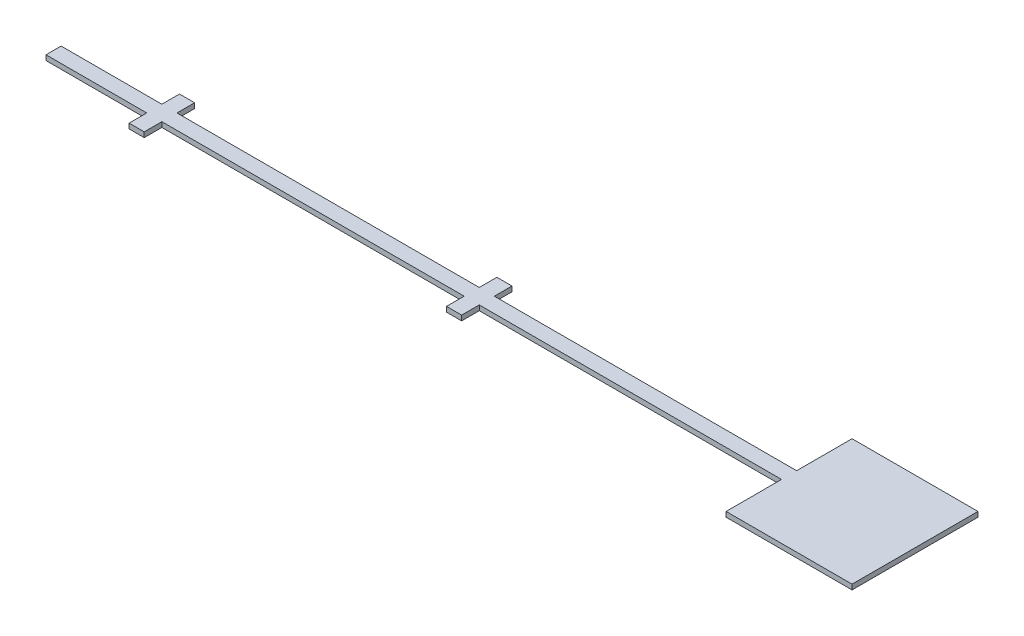
ISO-10303-21;
HEADER;
FILE_DESCRIPTION(('STEP AP214'),'2;1');
FILE_NAME('part.step','',(''),(''),'','','');
FILE_SCHEMA(('AUTOMOTIVE_DESIGN { 1 0 10303 214 1 1 1 1 }'));
ENDSEC;
DATA;
#1=APPLICATION_CONTEXT('core data for automotive mechanical design processes');
#2=APPLICATION_PROTOCOL_DEFINITION('international standard','automotive_design',2000,#1);
#3=PRODUCT_CONTEXT('',#1,'mechanical');
#4=PRODUCT('Part','Part','',(#3));
#5=PRODUCT_RELATED_PRODUCT_CATEGORY('part','',(#4));
#6=PRODUCT_DEFINITION_FORMATION('','',#4);
#7=PRODUCT_DEFINITION_CONTEXT('part definition',#1,'design');
#8=PRODUCT_DEFINITION('design','',#6,#7);
#9=PRODUCT_DEFINITION_SHAPE('','',#8);
#10=(LENGTH_UNIT() NAMED_UNIT(*) SI_UNIT(.MILLI.,.METRE.));
#11=(NAMED_UNIT(*) PLANE_ANGLE_UNIT() SI_UNIT($,.RADIAN.));
#12=(NAMED_UNIT(*) SI_UNIT($,.STERADIAN.) SOLID_ANGLE_UNIT());
#13=UNCERTAINTY_MEASURE_WITH_UNIT(LENGTH_MEASURE(1.E-05),#10,'distance_accuracy_value','');
#14=(GEOMETRIC_REPRESENTATION_CONTEXT(3) GLOBAL_UNCERTAINTY_ASSIGNED_CONTEXT((#13)) GLOBAL_UNIT_ASSIGNED_CONTEXT((#10,
#11,#12)) REPRESENTATION_CONTEXT('',''));
#15=CARTESIAN_POINT('',(0.,0.,0.));
#16=DIRECTION('',(0.,0.,1.));
#17=DIRECTION('',(1.,0.,0.));
#18=AXIS2_PLACEMENT_3D('',#15,#16,#17);
#19=CARTESIAN_POINT('',(-27.7142857142857,1.,-5.95238095238096));
#20=DIRECTION('',(0.,0.,1.));
#21=DIRECTION('',(1.,0.,0.));
#22=AXIS2_PLACEMENT_3D('',#19,#20,#21);
#23=PLANE('',#22);
#24=DIRECTION('',(-1.,0.,0.));
#25=VECTOR('',#24,1.);
#26=CARTESIAN_POINT('',(-27.7142857142857,0.,-5.95238095238096));
#27=LINE('',#26,#25);
#28=CARTESIAN_POINT('',(-27.7142857142857,0.,-5.95238095238096));
#29=VERTEX_POINT('',#28);
#30=CARTESIAN_POINT('',(-47.7142857142857,0.,-5.95238095238095));
#31=VERTEX_POINT('',#30);
#32=EDGE_CURVE('E225',#29,#31,#27,.T.);
#33=ORIENTED_EDGE('',*,*,#32,.T.);
#34=DIRECTION('',(0.,-1.,0.));
#35=VECTOR('',#34,1.);
#36=CARTESIAN_POINT('',(-47.7142857142857,1.,-5.95238095238095));
#37=LINE('',#36,#35);
#38=CARTESIAN_POINT('',(-47.7142857142857,1.,-5.95238095238095));
#39=VERTEX_POINT('',#38);
#40=EDGE_CURVE('E11',#39,#31,#37,.T.);
#41=ORIENTED_EDGE('',*,*,#40,.F.);
#42=DIRECTION('',(-1.,0.,0.));
#43=VECTOR('',#42,1.);
#44=CARTESIAN_POINT('',(-27.7142857142857,1.,-5.95238095238096));
#45=LINE('',#44,#43);
#46=CARTESIAN_POINT('',(-27.7142857142857,1.,-5.95238095238096));
#47=VERTEX_POINT('',#46);
#48=EDGE_CURVE('E271',#47,#39,#45,.T.);
#49=ORIENTED_EDGE('',*,*,#48,.F.);
#50=DIRECTION('',(0.,-1.,0.));
#51=VECTOR('',#50,1.);
#52=CARTESIAN_POINT('',(-27.7142857142857,1.,-5.95238095238096));
#53=LINE('',#52,#51);
#54=EDGE_CURVE('E221',#47,#29,#53,.T.);
#55=ORIENTED_EDGE('',*,*,#54,.T.);
#56=EDGE_LOOP('',(#33,#41,#49,#55));
#57=FACE_BOUND('',#56,.T.);
#58=ADVANCED_FACE('F33',(#57),#23,.F.);
#59=CARTESIAN_POINT('',(-47.7142857142857,1.,-5.95238095238095));
#60=DIRECTION('',(1.,0.,0.));
#61=DIRECTION('',(0.,0.,-1.));
#62=AXIS2_PLACEMENT_3D('',#59,#60,#61);
#63=PLANE('',#62);
#64=DIRECTION('',(0.,0.,1.));
#65=VECTOR('',#64,1.);
#66=CARTESIAN_POINT('',(-47.7142857142857,0.,-5.95238095238095));
#67=LINE('',#66,#65);
#68=CARTESIAN_POINT('',(-47.7142857142857,0.,-2.95238095238095));
#69=VERTEX_POINT('',#68);
#70=EDGE_CURVE('E228',#31,#69,#67,.T.);
#71=ORIENTED_EDGE('',*,*,#70,.T.);
#72=DIRECTION('',(0.,-1.,0.));
#73=VECTOR('',#72,1.);
#74=CARTESIAN_POINT('',(-47.7142857142857,1.,-2.95238095238095));
#75=LINE('',#74,#73);
#76=CARTESIAN_POINT('',(-47.7142857142857,1.,-2.95238095238095));
#77=VERTEX_POINT('',#76);
#78=EDGE_CURVE('E41',#77,#69,#75,.T.);
#79=ORIENTED_EDGE('',*,*,#78,.F.);
#80=DIRECTION('',(0.,0.,1.));
#81=VECTOR('',#80,1.);
#82=CARTESIAN_POINT('',(-47.7142857142857,1.,-5.95238095238095));
#83=LINE('',#82,#81);
#84=EDGE_CURVE('E140',#39,#77,#83,.T.);
#85=ORIENTED_EDGE('',*,*,#84,.F.);
#86=ORIENTED_EDGE('',*,*,#40,.T.);
#87=EDGE_LOOP('',(#71,#79,#85,#86));
#88=FACE_BOUND('',#87,.T.);
#89=ADVANCED_FACE('F409',(#88),#63,.F.);
#90=CARTESIAN_POINT('',(-47.7142857142857,1.,-2.95238095238095));
#91=DIRECTION('',(0.,0.,-1.));
#92=DIRECTION('',(-1.,0.,0.));
#93=AXIS2_PLACEMENT_3D('',#90,#91,#92);
#94=PLANE('',#93);
#95=DIRECTION('',(1.,0.,0.));
#96=VECTOR('',#95,1.);
#97=CARTESIAN_POINT('',(-47.7142857142857,0.,-2.95238095238095));
#98=LINE('',#97,#96);
#99=CARTESIAN_POINT('',(-27.7142857142857,0.,-2.95238095238095));
#100=VERTEX_POINT('',#99);
#101=EDGE_CURVE('E230',#69,#100,#98,.T.);
#102=ORIENTED_EDGE('',*,*,#101,.T.);
#103=DIRECTION('',(0.,-1.,0.));
#104=VECTOR('',#103,1.);
#105=CARTESIAN_POINT('',(-27.7142857142857,1.,-2.95238095238095));
#106=LINE('',#105,#104);
#107=CARTESIAN_POINT('',(-27.7142857142857,1.,-2.95238095238095));
#108=VERTEX_POINT('',#107);
#109=EDGE_CURVE('E326',#108,#100,#106,.T.);
#110=ORIENTED_EDGE('',*,*,#109,.F.);
#111=DIRECTION('',(1.,0.,0.));
#112=VECTOR('',#111,1.);
#113=CARTESIAN_POINT('',(-47.7142857142857,1.,-2.95238095238095));
#114=LINE('',#113,#112);
#115=EDGE_CURVE('E334',#77,#108,#114,.T.);
#116=ORIENTED_EDGE('',*,*,#115,.F.);
#117=ORIENTED_EDGE('',*,*,#78,.T.);
#118=EDGE_LOOP('',(#102,#110,#116,#117));
#119=FACE_BOUND('',#118,.T.);
#120=ADVANCED_FACE('F332',(#119),#94,.F.);
#121=CARTESIAN_POINT('',(-27.7142857142857,1.,-2.95238095238095));
#122=DIRECTION('',(1.,0.,0.));
#123=DIRECTION('',(0.,0.,-1.));
#124=AXIS2_PLACEMENT_3D('',#121,#122,#123);
#125=PLANE('',#124);
#126=DIRECTION('',(0.,0.,1.));
#127=VECTOR('',#126,1.);
#128=CARTESIAN_POINT('',(-27.7142857142857,0.,-2.95238095238095));
#129=LINE('',#128,#127);
#130=CARTESIAN_POINT('',(-27.7142857142857,0.,0.547619047619043));
#131=VERTEX_POINT('',#130);
#132=EDGE_CURVE('E232',#100,#131,#129,.T.);
#133=ORIENTED_EDGE('',*,*,#132,.T.);
#134=DIRECTION('',(0.,-1.,0.));
#135=VECTOR('',#134,1.);
#136=CARTESIAN_POINT('',(-27.7142857142857,1.,0.547619047619043));
#137=LINE('',#136,#135);
#138=CARTESIAN_POINT('',(-27.7142857142857,1.,0.547619047619043));
#139=VERTEX_POINT('',#138);
#140=EDGE_CURVE('E323',#139,#131,#137,.T.);
#141=ORIENTED_EDGE('',*,*,#140,.F.);
#142=DIRECTION('',(0.,0.,1.));
#143=VECTOR('',#142,1.);
#144=CARTESIAN_POINT('',(-27.7142857142857,1.,-2.95238095238095));
#145=LINE('',#144,#143);
#146=EDGE_CURVE('E352',#108,#139,#145,.T.);
#147=ORIENTED_EDGE('',*,*,#146,.F.);
#148=ORIENTED_EDGE('',*,*,#109,.T.);
#149=EDGE_LOOP('',(#133,#141,#147,#148));
#150=FACE_BOUND('',#149,.T.);
#151=ADVANCED_FACE('F343',(#150),#125,.F.);
#152=CARTESIAN_POINT('',(-27.7142857142857,1.,0.547619047619043));
#153=DIRECTION('',(0.,0.,-1.));
#154=DIRECTION('',(-1.,0.,0.));
#155=AXIS2_PLACEMENT_3D('',#152,#153,#154);
#156=PLANE('',#155);
#157=DIRECTION('',(1.,0.,0.));
#158=VECTOR('',#157,1.);
#159=CARTESIAN_POINT('',(-27.7142857142857,0.,0.547619047619043));
#160=LINE('',#159,#158);
#161=CARTESIAN_POINT('',(-24.7142857142857,0.,0.547619047619043));
#162=VERTEX_POINT('',#161);
#163=EDGE_CURVE('E234',#131,#162,#160,.T.);
#164=ORIENTED_EDGE('',*,*,#163,.T.);
#165=DIRECTION('',(0.,-1.,0.));
#166=VECTOR('',#165,1.);
#167=CARTESIAN_POINT('',(-24.7142857142857,1.,0.547619047619043));
#168=LINE('',#167,#166);
#169=CARTESIAN_POINT('',(-24.7142857142857,1.,0.547619047619043));
#170=VERTEX_POINT('',#169);
#171=EDGE_CURVE('E320',#170,#162,#168,.T.);
#172=ORIENTED_EDGE('',*,*,#171,.F.);
#173=DIRECTION('',(1.,0.,0.));
#174=VECTOR('',#173,1.);
#175=CARTESIAN_POINT('',(-27.7142857142857,1.,0.547619047619043));
#176=LINE('',#175,#174);
#177=EDGE_CURVE('E349',#139,#170,#176,.T.);
#178=ORIENTED_EDGE('',*,*,#177,.F.);
#179=ORIENTED_EDGE('',*,*,#140,.T.);
#180=EDGE_LOOP('',(#164,#172,#178,#179));
#181=FACE_BOUND('',#180,.T.);
#182=ADVANCED_FACE('F347',(#181),#156,.F.);
#183=CARTESIAN_POINT('',(-24.7142857142857,1.,0.547619047619043));
#184=DIRECTION('',(-1.,0.,0.));
#185=DIRECTION('',(0.,0.,1.));
#186=AXIS2_PLACEMENT_3D('',#183,#184,#185);
#187=PLANE('',#186);
#188=DIRECTION('',(0.,0.,-1.));
#189=VECTOR('',#188,1.);
#190=CARTESIAN_POINT('',(-24.7142857142857,0.,0.547619047619043));
#191=LINE('',#190,#189);
#192=CARTESIAN_POINT('',(-24.7142857142857,0.,-2.95238095238096));
#193=VERTEX_POINT('',#192);
#194=EDGE_CURVE('E236',#162,#193,#191,.T.);
#195=ORIENTED_EDGE('',*,*,#194,.T.);
#196=DIRECTION('',(0.,-1.,0.));
#197=VECTOR('',#196,1.);
#198=CARTESIAN_POINT('',(-24.7142857142857,1.,-2.95238095238096));
#199=LINE('',#198,#197);
#200=CARTESIAN_POINT('',(-24.7142857142857,1.,-2.95238095238096));
#201=VERTEX_POINT('',#200);
#202=EDGE_CURVE('E317',#201,#193,#199,.T.);
#203=ORIENTED_EDGE('',*,*,#202,.F.);
#204=DIRECTION('',(0.,0.,-1.));
#205=VECTOR('',#204,1.);
#206=CARTESIAN_POINT('',(-24.7142857142857,1.,0.547619047619043));
#207=LINE('',#206,#205);
#208=EDGE_CURVE('E351',#170,#201,#207,.T.);
#209=ORIENTED_EDGE('',*,*,#208,.F.);
#210=ORIENTED_EDGE('',*,*,#171,.T.);
#211=EDGE_LOOP('',(#195,#203,#209,#210));
#212=FACE_BOUND('',#211,.T.);
#213=ADVANCED_FACE('F422',(#212),#187,.F.);
#214=CARTESIAN_POINT('',(-24.7142857142857,1.,-2.95238095238096));
#215=DIRECTION('',(0.,0.,-1.));
#216=DIRECTION('',(-1.,0.,0.));
#217=AXIS2_PLACEMENT_3D('',#214,#215,#216);
#218=PLANE('',#217);
#219=DIRECTION('',(1.,0.,0.));
#220=VECTOR('',#219,1.);
#221=CARTESIAN_POINT('',(-24.7142857142857,0.,-2.95238095238096));
#222=LINE('',#221,#220);
#223=CARTESIAN_POINT('',(35.2857142857143,0.,-2.95238095238096));
#224=VERTEX_POINT('',#223);
#225=EDGE_CURVE('E238',#193,#224,#222,.T.);
#226=ORIENTED_EDGE('',*,*,#225,.T.);
#227=DIRECTION('',(0.,-1.,0.));
#228=VECTOR('',#227,1.);
#229=CARTESIAN_POINT('',(35.2857142857143,1.,-2.95238095238096));
#230=LINE('',#229,#228);
#231=CARTESIAN_POINT('',(35.2857142857143,1.,-2.95238095238096));
#232=VERTEX_POINT('',#231);
#233=EDGE_CURVE('E314',#232,#224,#230,.T.);
#234=ORIENTED_EDGE('',*,*,#233,.F.);
#235=DIRECTION('',(1.,0.,0.));
#236=VECTOR('',#235,1.);
#237=CARTESIAN_POINT('',(-24.7142857142857,1.,-2.95238095238096));
#238=LINE('',#237,#236);
#239=EDGE_CURVE('E354',#201,#232,#238,.T.);
#240=ORIENTED_EDGE('',*,*,#239,.F.);
#241=ORIENTED_EDGE('',*,*,#202,.T.);
#242=EDGE_LOOP('',(#226,#234,#240,#241));
#243=FACE_BOUND('',#242,.T.);
#244=ADVANCED_FACE('F425',(#243),#218,.F.);
#245=CARTESIAN_POINT('',(35.2857142857143,1.,-2.95238095238096));
#246=DIRECTION('',(1.,0.,0.));
#247=DIRECTION('',(0.,0.,-1.));
#248=AXIS2_PLACEMENT_3D('',#245,#246,#247);
#249=PLANE('',#248);
#250=DIRECTION('',(0.,0.,1.));
#251=VECTOR('',#250,1.);
#252=CARTESIAN_POINT('',(35.2857142857143,0.,-2.95238095238096));
#253=LINE('',#252,#251);
#254=CARTESIAN_POINT('',(35.2857142857143,0.,0.547619047619033));
#255=VERTEX_POINT('',#254);
#256=EDGE_CURVE('E240',#224,#255,#253,.T.);
#257=ORIENTED_EDGE('',*,*,#256,.T.);
#258=DIRECTION('',(0.,-1.,0.));
#259=VECTOR('',#258,1.);
#260=CARTESIAN_POINT('',(35.2857142857143,1.,0.547619047619033));
#261=LINE('',#260,#259);
#262=CARTESIAN_POINT('',(35.2857142857143,1.,0.547619047619033));
#263=VERTEX_POINT('',#262);
#264=EDGE_CURVE('E311',#263,#255,#261,.T.);
#265=ORIENTED_EDGE('',*,*,#264,.F.);
#266=DIRECTION('',(0.,0.,1.));
#267=VECTOR('',#266,1.);
#268=CARTESIAN_POINT('',(35.2857142857143,1.,-2.95238095238096));
#269=LINE('',#268,#267);
#270=EDGE_CURVE('E360',#232,#263,#269,.T.);
#271=ORIENTED_EDGE('',*,*,#270,.F.);
#272=ORIENTED_EDGE('',*,*,#233,.T.);
#273=EDGE_LOOP('',(#257,#265,#271,#272));
#274=FACE_BOUND('',#273,.T.);
#275=ADVANCED_FACE('F429',(#274),#249,.F.);
#276=CARTESIAN_POINT('',(35.2857142857143,1.,0.547619047619033));
#277=DIRECTION('',(0.,0.,-1.));
#278=DIRECTION('',(-1.,0.,0.));
#279=AXIS2_PLACEMENT_3D('',#276,#277,#278);
#280=PLANE('',#279);
#281=DIRECTION('',(1.,0.,0.));
#282=VECTOR('',#281,1.);
#283=CARTESIAN_POINT('',(35.2857142857143,0.,0.547619047619033));
#284=LINE('',#283,#282);
#285=CARTESIAN_POINT('',(38.2857142857143,0.,0.547619047619033));
#286=VERTEX_POINT('',#285);
#287=EDGE_CURVE('E242',#255,#286,#284,.T.);
#288=ORIENTED_EDGE('',*,*,#287,.T.);
#289=DIRECTION('',(0.,-1.,0.));
#290=VECTOR('',#289,1.);
#291=CARTESIAN_POINT('',(38.2857142857143,1.,0.547619047619033));
#292=LINE('',#291,#290);
#293=CARTESIAN_POINT('',(38.2857142857143,1.,0.547619047619033));
#294=VERTEX_POINT('',#293);
#295=EDGE_CURVE('E308',#294,#286,#292,.T.);
#296=ORIENTED_EDGE('',*,*,#295,.F.);
#297=DIRECTION('',(1.,0.,0.));
#298=VECTOR('',#297,1.);
#299=CARTESIAN_POINT('',(35.2857142857143,1.,0.547619047619033));
#300=LINE('',#299,#298);
#301=EDGE_CURVE('E362',#263,#294,#300,.T.);
#302=ORIENTED_EDGE('',*,*,#301,.F.);
#303=ORIENTED_EDGE('',*,*,#264,.T.);
#304=EDGE_LOOP('',(#288,#296,#302,#303));
#305=FACE_BOUND('',#304,.T.);
#306=ADVANCED_FACE('F433',(#305),#280,.F.);
#307=CARTESIAN_POINT('',(38.2857142857143,1.,0.547619047619033));
#308=DIRECTION('',(-1.,0.,0.));
#309=DIRECTION('',(0.,0.,1.));
#310=AXIS2_PLACEMENT_3D('',#307,#308,#309);
#311=PLANE('',#310);
#312=DIRECTION('',(0.,0.,-1.));
#313=VECTOR('',#312,1.);
#314=CARTESIAN_POINT('',(38.2857142857143,0.,0.547619047619033));
#315=LINE('',#314,#313);
#316=CARTESIAN_POINT('',(38.2857142857143,0.,-2.95238095238097));
#317=VERTEX_POINT('',#316);
#318=EDGE_CURVE('E244',#286,#317,#315,.T.);
#319=ORIENTED_EDGE('',*,*,#318,.T.);
#320=DIRECTION('',(0.,-1.,0.));
#321=VECTOR('',#320,1.);
#322=CARTESIAN_POINT('',(38.2857142857143,1.,-2.95238095238097));
#323=LINE('',#322,#321);
#324=CARTESIAN_POINT('',(38.2857142857143,1.,-2.95238095238097));
#325=VERTEX_POINT('',#324);
#326=EDGE_CURVE('E305',#325,#317,#323,.T.);
#327=ORIENTED_EDGE('',*,*,#326,.F.);
#328=DIRECTION('',(0.,0.,-1.));
#329=VECTOR('',#328,1.);
#330=CARTESIAN_POINT('',(38.2857142857143,1.,0.547619047619033));
#331=LINE('',#330,#329);
#332=EDGE_CURVE('E364',#294,#325,#331,.T.);
#333=ORIENTED_EDGE('',*,*,#332,.F.);
#334=ORIENTED_EDGE('',*,*,#295,.T.);
#335=EDGE_LOOP('',(#319,#327,#333,#334));
#336=FACE_BOUND('',#335,.T.);
#337=ADVANCED_FACE('F437',(#336),#311,.F.);
#338=CARTESIAN_POINT('',(38.2857142857143,1.,-2.95238095238097));
#339=DIRECTION('',(0.,0.,-1.));
#340=DIRECTION('',(-1.,0.,0.));
#341=AXIS2_PLACEMENT_3D('',#338,#339,#340);
#342=PLANE('',#341);
#343=DIRECTION('',(1.,0.,0.));
#344=VECTOR('',#343,1.);
#345=CARTESIAN_POINT('',(38.2857142857143,0.,-2.95238095238097));
#346=LINE('',#345,#344);
#347=CARTESIAN_POINT('',(98.2857142857143,0.,-2.95238095238097));
#348=VERTEX_POINT('',#347);
#349=EDGE_CURVE('E246',#317,#348,#346,.T.);
#350=ORIENTED_EDGE('',*,*,#349,.T.);
#351=DIRECTION('',(0.,-1.,0.));
#352=VECTOR('',#351,1.);
#353=CARTESIAN_POINT('',(98.2857142857143,1.,-2.95238095238097));
#354=LINE('',#353,#352);
#355=CARTESIAN_POINT('',(98.2857142857143,1.,-2.95238095238097));
#356=VERTEX_POINT('',#355);
#357=EDGE_CURVE('E302',#356,#348,#354,.T.);
#358=ORIENTED_EDGE('',*,*,#357,.F.);
#359=DIRECTION('',(1.,0.,0.));
#360=VECTOR('',#359,1.);
#361=CARTESIAN_POINT('',(38.2857142857143,1.,-2.95238095238097));
#362=LINE('',#361,#360);
#363=EDGE_CURVE('E366',#325,#356,#362,.T.);
#364=ORIENTED_EDGE('',*,*,#363,.F.);
#365=ORIENTED_EDGE('',*,*,#326,.T.);
#366=EDGE_LOOP('',(#350,#358,#364,#365));
#367=FACE_BOUND('',#366,.T.);
#368=ADVANCED_FACE('F441',(#367),#342,.F.);
#369=CARTESIAN_POINT('',(98.2857142857143,1.,-2.95238095238097));
#370=DIRECTION('',(1.,0.,0.));
#371=DIRECTION('',(0.,0.,-1.));
#372=AXIS2_PLACEMENT_3D('',#369,#370,#371);
#373=PLANE('',#372);
#374=DIRECTION('',(0.,0.,1.));
#375=VECTOR('',#374,1.);
#376=CARTESIAN_POINT('',(98.2857142857143,0.,-2.95238095238097));
#377=LINE('',#376,#375);
#378=CARTESIAN_POINT('',(98.2857142857143,0.,8.04761904761903));
#379=VERTEX_POINT('',#378);
#380=EDGE_CURVE('E248',#348,#379,#377,.T.);
#381=ORIENTED_EDGE('',*,*,#380,.T.);
#382=DIRECTION('',(0.,-1.,0.));
#383=VECTOR('',#382,1.);
#384=CARTESIAN_POINT('',(98.2857142857143,1.,8.04761904761903));
#385=LINE('',#384,#383);
#386=CARTESIAN_POINT('',(98.2857142857143,1.,8.04761904761903));
#387=VERTEX_POINT('',#386);
#388=EDGE_CURVE('E299',#387,#379,#385,.T.);
#389=ORIENTED_EDGE('',*,*,#388,.F.);
#390=DIRECTION('',(0.,0.,1.));
#391=VECTOR('',#390,1.);
#392=CARTESIAN_POINT('',(98.2857142857143,1.,-2.95238095238097));
#393=LINE('',#392,#391);
#394=EDGE_CURVE('E368',#356,#387,#393,.T.);
#395=ORIENTED_EDGE('',*,*,#394,.F.);
#396=ORIENTED_EDGE('',*,*,#357,.T.);
#397=EDGE_LOOP('',(#381,#389,#395,#396));
#398=FACE_BOUND('',#397,.T.);
#399=ADVANCED_FACE('F445',(#398),#373,.F.);
#400=CARTESIAN_POINT('',(98.2857142857143,1.,8.04761904761903));
#401=DIRECTION('',(0.,0.,-1.));
#402=DIRECTION('',(-1.,0.,0.));
#403=AXIS2_PLACEMENT_3D('',#400,#401,#402);
#404=PLANE('',#403);
#405=DIRECTION('',(1.,0.,0.));
#406=VECTOR('',#405,1.);
#407=CARTESIAN_POINT('',(98.2857142857143,0.,8.04761904761903));
#408=LINE('',#407,#406);
#409=CARTESIAN_POINT('',(123.285714285714,0.,8.04761904761904));
#410=VERTEX_POINT('',#409);
#411=EDGE_CURVE('E250',#379,#410,#408,.T.);
#412=ORIENTED_EDGE('',*,*,#411,.T.);
#413=DIRECTION('',(0.,-1.,0.));
#414=VECTOR('',#413,1.);
#415=CARTESIAN_POINT('',(123.285714285714,1.,8.04761904761904));
#416=LINE('',#415,#414);
#417=CARTESIAN_POINT('',(123.285714285714,1.,8.04761904761904));
#418=VERTEX_POINT('',#417);
#419=EDGE_CURVE('E296',#418,#410,#416,.T.);
#420=ORIENTED_EDGE('',*,*,#419,.F.);
#421=DIRECTION('',(1.,0.,0.));
#422=VECTOR('',#421,1.);
#423=CARTESIAN_POINT('',(98.2857142857143,1.,8.04761904761903));
#424=LINE('',#423,#422);
#425=EDGE_CURVE('E370',#387,#418,#424,.T.);
#426=ORIENTED_EDGE('',*,*,#425,.F.);
#427=ORIENTED_EDGE('',*,*,#388,.T.);
#428=EDGE_LOOP('',(#412,#420,#426,#427));
#429=FACE_BOUND('',#428,.T.);
#430=ADVANCED_FACE('F449',(#429),#404,.F.);
#431=CARTESIAN_POINT('',(123.285714285714,1.,8.04761904761904));
#432=DIRECTION('',(-1.,0.,0.));
#433=DIRECTION('',(0.,0.,1.));
#434=AXIS2_PLACEMENT_3D('',#431,#432,#433);
#435=PLANE('',#434);
#436=DIRECTION('',(0.,0.,-1.));
#437=VECTOR('',#436,1.);
#438=CARTESIAN_POINT('',(123.285714285714,0.,8.04761904761904));
#439=LINE('',#438,#437);
#440=CARTESIAN_POINT('',(123.285714285714,0.,-16.952380952381));
#441=VERTEX_POINT('',#440);
#442=EDGE_CURVE('E252',#410,#441,#439,.T.);
#443=ORIENTED_EDGE('',*,*,#442,.T.);
#444=DIRECTION('',(0.,-1.,0.));
#445=VECTOR('',#444,1.);
#446=CARTESIAN_POINT('',(123.285714285714,1.,-16.952380952381));
#447=LINE('',#446,#445);
#448=CARTESIAN_POINT('',(123.285714285714,1.,-16.952380952381));
#449=VERTEX_POINT('',#448);
#450=EDGE_CURVE('E293',#449,#441,#447,.T.);
#451=ORIENTED_EDGE('',*,*,#450,.F.);
#452=DIRECTION('',(0.,0.,-1.));
#453=VECTOR('',#452,1.);
#454=CARTESIAN_POINT('',(123.285714285714,1.,8.04761904761904));
#455=LINE('',#454,#453);
#456=EDGE_CURVE('E372',#418,#449,#455,.T.);
#457=ORIENTED_EDGE('',*,*,#456,.F.);
#458=ORIENTED_EDGE('',*,*,#419,.T.);
#459=EDGE_LOOP('',(#443,#451,#457,#458));
#460=FACE_BOUND('',#459,.T.);
#461=ADVANCED_FACE('F453',(#460),#435,.F.);
#462=CARTESIAN_POINT('',(123.285714285714,1.,-16.952380952381));
#463=DIRECTION('',(0.,0.,1.));
#464=DIRECTION('',(1.,0.,0.));
#465=AXIS2_PLACEMENT_3D('',#462,#463,#464);
#466=PLANE('',#465);
#467=DIRECTION('',(-1.,0.,0.));
#468=VECTOR('',#467,1.);
#469=CARTESIAN_POINT('',(123.285714285714,0.,-16.952380952381));
#470=LINE('',#469,#468);
#471=CARTESIAN_POINT('',(98.2857142857143,0.,-16.952380952381));
#472=VERTEX_POINT('',#471);
#473=EDGE_CURVE('E254',#441,#472,#470,.T.);
#474=ORIENTED_EDGE('',*,*,#473,.T.);
#475=DIRECTION('',(0.,-1.,0.));
#476=VECTOR('',#475,1.);
#477=CARTESIAN_POINT('',(98.2857142857143,1.,-16.952380952381));
#478=LINE('',#477,#476);
#479=CARTESIAN_POINT('',(98.2857142857143,1.,-16.952380952381));
#480=VERTEX_POINT('',#479);
#481=EDGE_CURVE('E290',#480,#472,#478,.T.);
#482=ORIENTED_EDGE('',*,*,#481,.F.);
#483=DIRECTION('',(-1.,0.,0.));
#484=VECTOR('',#483,1.);
#485=CARTESIAN_POINT('',(123.285714285714,1.,-16.952380952381));
#486=LINE('',#485,#484);
#487=EDGE_CURVE('E374',#449,#480,#486,.T.);
#488=ORIENTED_EDGE('',*,*,#487,.F.);
#489=ORIENTED_EDGE('',*,*,#450,.T.);
#490=EDGE_LOOP('',(#474,#482,#488,#489));
#491=FACE_BOUND('',#490,.T.);
#492=ADVANCED_FACE('F457',(#491),#466,.F.);
#493=CARTESIAN_POINT('',(98.2857142857143,1.,-16.952380952381));
#494=DIRECTION('',(1.,0.,0.));
#495=DIRECTION('',(0.,0.,-1.));
#496=AXIS2_PLACEMENT_3D('',#493,#494,#495);
#497=PLANE('',#496);
#498=DIRECTION('',(0.,0.,1.));
#499=VECTOR('',#498,1.);
#500=CARTESIAN_POINT('',(98.2857142857143,0.,-16.952380952381));
#501=LINE('',#500,#499);
#502=CARTESIAN_POINT('',(98.2857142857143,0.,-5.95238095238098));
#503=VERTEX_POINT('',#502);
#504=EDGE_CURVE('E256',#472,#503,#501,.T.);
#505=ORIENTED_EDGE('',*,*,#504,.T.);
#506=DIRECTION('',(0.,-1.,0.));
#507=VECTOR('',#506,1.);
#508=CARTESIAN_POINT('',(98.2857142857143,1.,-5.95238095238098));
#509=LINE('',#508,#507);
#510=CARTESIAN_POINT('',(98.2857142857143,1.,-5.95238095238098));
#511=VERTEX_POINT('',#510);
#512=EDGE_CURVE('E287',#511,#503,#509,.T.);
#513=ORIENTED_EDGE('',*,*,#512,.F.);
#514=DIRECTION('',(0.,0.,1.));
#515=VECTOR('',#514,1.);
#516=CARTESIAN_POINT('',(98.2857142857143,1.,-16.952380952381));
#517=LINE('',#516,#515);
#518=EDGE_CURVE('E376',#480,#511,#517,.T.);
#519=ORIENTED_EDGE('',*,*,#518,.F.);
#520=ORIENTED_EDGE('',*,*,#481,.T.);
#521=EDGE_LOOP('',(#505,#513,#519,#520));
#522=FACE_BOUND('',#521,.T.);
#523=ADVANCED_FACE('F461',(#522),#497,.F.);
#524=CARTESIAN_POINT('',(98.2857142857143,1.,-5.95238095238098));
#525=DIRECTION('',(0.,0.,1.));
#526=DIRECTION('',(1.,0.,0.));
#527=AXIS2_PLACEMENT_3D('',#524,#525,#526);
#528=PLANE('',#527);
#529=DIRECTION('',(-1.,0.,0.));
#530=VECTOR('',#529,1.);
#531=CARTESIAN_POINT('',(98.2857142857143,0.,-5.95238095238098));
#532=LINE('',#531,#530);
#533=CARTESIAN_POINT('',(38.2857142857142,0.,-5.95238095238097));
#534=VERTEX_POINT('',#533);
#535=EDGE_CURVE('E258',#503,#534,#532,.T.);
#536=ORIENTED_EDGE('',*,*,#535,.T.);
#537=DIRECTION('',(0.,-1.,0.));
#538=VECTOR('',#537,1.);
#539=CARTESIAN_POINT('',(38.2857142857142,1.,-5.95238095238097));
#540=LINE('',#539,#538);
#541=CARTESIAN_POINT('',(38.2857142857142,1.,-5.95238095238097));
#542=VERTEX_POINT('',#541);
#543=EDGE_CURVE('E284',#542,#534,#540,.T.);
#544=ORIENTED_EDGE('',*,*,#543,.F.);
#545=DIRECTION('',(-1.,0.,0.));
#546=VECTOR('',#545,1.);
#547=CARTESIAN_POINT('',(98.2857142857143,1.,-5.95238095238098));
#548=LINE('',#547,#546);
#549=EDGE_CURVE('E378',#511,#542,#548,.T.);
#550=ORIENTED_EDGE('',*,*,#549,.F.);
#551=ORIENTED_EDGE('',*,*,#512,.T.);
#552=EDGE_LOOP('',(#536,#544,#550,#551));
#553=FACE_BOUND('',#552,.T.);
#554=ADVANCED_FACE('F465',(#553),#528,.F.);
#555=CARTESIAN_POINT('',(38.2857142857142,1.,-5.95238095238097));
#556=DIRECTION('',(-1.,0.,0.));
#557=DIRECTION('',(0.,0.,1.));
#558=AXIS2_PLACEMENT_3D('',#555,#556,#557);
#559=PLANE('',#558);
#560=DIRECTION('',(0.,0.,-1.));
#561=VECTOR('',#560,1.);
#562=CARTESIAN_POINT('',(38.2857142857142,0.,-5.95238095238097));
#563=LINE('',#562,#561);
#564=CARTESIAN_POINT('',(38.2857142857142,0.,-9.45238095238096));
#565=VERTEX_POINT('',#564);
#566=EDGE_CURVE('E260',#534,#565,#563,.T.);
#567=ORIENTED_EDGE('',*,*,#566,.T.);
#568=DIRECTION('',(0.,-1.,0.));
#569=VECTOR('',#568,1.);
#570=CARTESIAN_POINT('',(38.2857142857142,1.,-9.45238095238096));
#571=LINE('',#570,#569);
#572=CARTESIAN_POINT('',(38.2857142857142,1.,-9.45238095238096));
#573=VERTEX_POINT('',#572);
#574=EDGE_CURVE('E281',#573,#565,#571,.T.);
#575=ORIENTED_EDGE('',*,*,#574,.F.);
#576=DIRECTION('',(0.,0.,-1.));
#577=VECTOR('',#576,1.);
#578=CARTESIAN_POINT('',(38.2857142857142,1.,-5.95238095238097));
#579=LINE('',#578,#577);
#580=EDGE_CURVE('E380',#542,#573,#579,.T.);
#581=ORIENTED_EDGE('',*,*,#580,.F.);
#582=ORIENTED_EDGE('',*,*,#543,.T.);
#583=EDGE_LOOP('',(#567,#575,#581,#582));
#584=FACE_BOUND('',#583,.T.);
#585=ADVANCED_FACE('F469',(#584),#559,.F.);
#586=CARTESIAN_POINT('',(38.2857142857142,1.,-9.45238095238096));
#587=DIRECTION('',(0.,0.,1.));
#588=DIRECTION('',(1.,0.,0.));
#589=AXIS2_PLACEMENT_3D('',#586,#587,#588);
#590=PLANE('',#589);
#591=DIRECTION('',(-1.,0.,0.));
#592=VECTOR('',#591,1.);
#593=CARTESIAN_POINT('',(38.2857142857142,0.,-9.45238095238096));
#594=LINE('',#593,#592);
#595=CARTESIAN_POINT('',(35.2857142857143,0.,-9.45238095238096));
#596=VERTEX_POINT('',#595);
#597=EDGE_CURVE('E262',#565,#596,#594,.T.);
#598=ORIENTED_EDGE('',*,*,#597,.T.);
#599=DIRECTION('',(0.,-1.,0.));
#600=VECTOR('',#599,1.);
#601=CARTESIAN_POINT('',(35.2857142857143,1.,-9.45238095238096));
#602=LINE('',#601,#600);
#603=CARTESIAN_POINT('',(35.2857142857143,1.,-9.45238095238096));
#604=VERTEX_POINT('',#603);
#605=EDGE_CURVE('E278',#604,#596,#602,.T.);
#606=ORIENTED_EDGE('',*,*,#605,.F.);
#607=DIRECTION('',(-1.,0.,0.));
#608=VECTOR('',#607,1.);
#609=CARTESIAN_POINT('',(38.2857142857142,1.,-9.45238095238096));
#610=LINE('',#609,#608);
#611=EDGE_CURVE('E382',#573,#604,#610,.T.);
#612=ORIENTED_EDGE('',*,*,#611,.F.);
#613=ORIENTED_EDGE('',*,*,#574,.T.);
#614=EDGE_LOOP('',(#598,#606,#612,#613));
#615=FACE_BOUND('',#614,.T.);
#616=ADVANCED_FACE('F473',(#615),#590,.F.);
#617=CARTESIAN_POINT('',(35.2857142857143,1.,-9.45238095238096));
#618=DIRECTION('',(1.,0.,0.));
#619=DIRECTION('',(0.,0.,-1.));
#620=AXIS2_PLACEMENT_3D('',#617,#618,#619);
#621=PLANE('',#620);
#622=DIRECTION('',(0.,0.,1.));
#623=VECTOR('',#622,1.);
#624=CARTESIAN_POINT('',(35.2857142857143,0.,-9.45238095238096));
#625=LINE('',#624,#623);
#626=CARTESIAN_POINT('',(35.2857142857143,0.,-5.95238095238096));
#627=VERTEX_POINT('',#626);
#628=EDGE_CURVE('E264',#596,#627,#625,.T.);
#629=ORIENTED_EDGE('',*,*,#628,.T.);
#630=DIRECTION('',(0.,-1.,0.));
#631=VECTOR('',#630,1.);
#632=CARTESIAN_POINT('',(35.2857142857143,1.,-5.95238095238096));
#633=LINE('',#632,#631);
#634=CARTESIAN_POINT('',(35.2857142857143,1.,-5.95238095238096));
#635=VERTEX_POINT('',#634);
#636=EDGE_CURVE('E275',#635,#627,#633,.T.);
#637=ORIENTED_EDGE('',*,*,#636,.F.);
#638=DIRECTION('',(0.,0.,1.));
#639=VECTOR('',#638,1.);
#640=CARTESIAN_POINT('',(35.2857142857143,1.,-9.45238095238096));
#641=LINE('',#640,#639);
#642=EDGE_CURVE('E384',#604,#635,#641,.T.);
#643=ORIENTED_EDGE('',*,*,#642,.F.);
#644=ORIENTED_EDGE('',*,*,#605,.T.);
#645=EDGE_LOOP('',(#629,#637,#643,#644));
#646=FACE_BOUND('',#645,.T.);
#647=ADVANCED_FACE('F390',(#646),#621,.F.);
#648=CARTESIAN_POINT('',(35.2857142857143,1.,-5.95238095238096));
#649=DIRECTION('',(0.,0.,1.));
#650=DIRECTION('',(1.,0.,0.));
#651=AXIS2_PLACEMENT_3D('',#648,#649,#650);
#652=PLANE('',#651);
#653=DIRECTION('',(-1.,0.,0.));
#654=VECTOR('',#653,1.);
#655=CARTESIAN_POINT('',(35.2857142857143,0.,-5.95238095238096));
#656=LINE('',#655,#654);
#657=CARTESIAN_POINT('',(-24.7142857142857,0.,-5.95238095238096));
#658=VERTEX_POINT('',#657);
#659=EDGE_CURVE('E266',#627,#658,#656,.T.);
#660=ORIENTED_EDGE('',*,*,#659,.T.);
#661=DIRECTION('',(0.,-1.,0.));
#662=VECTOR('',#661,1.);
#663=CARTESIAN_POINT('',(-24.7142857142857,1.,-5.95238095238096));
#664=LINE('',#663,#662);
#665=CARTESIAN_POINT('',(-24.7142857142857,1.,-5.95238095238096));
#666=VERTEX_POINT('',#665);
#667=EDGE_CURVE('E216',#666,#658,#664,.T.);
#668=ORIENTED_EDGE('',*,*,#667,.F.);
#669=DIRECTION('',(-1.,0.,0.));
#670=VECTOR('',#669,1.);
#671=CARTESIAN_POINT('',(35.2857142857143,1.,-5.95238095238096));
#672=LINE('',#671,#670);
#673=EDGE_CURVE('E207',#635,#666,#672,.T.);
#674=ORIENTED_EDGE('',*,*,#673,.F.);
#675=ORIENTED_EDGE('',*,*,#636,.T.);
#676=EDGE_LOOP('',(#660,#668,#674,#675));
#677=FACE_BOUND('',#676,.T.);
#678=ADVANCED_FACE('F394',(#677),#652,.F.);
#679=CARTESIAN_POINT('',(-24.7142857142857,1.,-5.95238095238096));
#680=DIRECTION('',(-1.,0.,0.));
#681=DIRECTION('',(0.,0.,1.));
#682=AXIS2_PLACEMENT_3D('',#679,#680,#681);
#683=PLANE('',#682);
#684=DIRECTION('',(0.,0.,-1.));
#685=VECTOR('',#684,1.);
#686=CARTESIAN_POINT('',(-24.7142857142857,0.,-5.95238095238096));
#687=LINE('',#686,#685);
#688=CARTESIAN_POINT('',(-24.7142857142857,0.,-9.45238095238096));
#689=VERTEX_POINT('',#688);
#690=EDGE_CURVE('E215',#658,#689,#687,.T.);
#691=ORIENTED_EDGE('',*,*,#690,.T.);
#692=DIRECTION('',(0.,-1.,0.));
#693=VECTOR('',#692,1.);
#694=CARTESIAN_POINT('',(-24.7142857142857,1.,-9.45238095238096));
#695=LINE('',#694,#693);
#696=CARTESIAN_POINT('',(-24.7142857142857,1.,-9.45238095238096));
#697=VERTEX_POINT('',#696);
#698=EDGE_CURVE('E212',#697,#689,#695,.T.);
#699=ORIENTED_EDGE('',*,*,#698,.F.);
#700=DIRECTION('',(0.,0.,-1.));
#701=VECTOR('',#700,1.);
#702=CARTESIAN_POINT('',(-24.7142857142857,1.,-5.95238095238096));
#703=LINE('',#702,#701);
#704=EDGE_CURVE('E201',#666,#697,#703,.T.);
#705=ORIENTED_EDGE('',*,*,#704,.F.);
#706=ORIENTED_EDGE('',*,*,#667,.T.);
#707=EDGE_LOOP('',(#691,#699,#705,#706));
#708=FACE_BOUND('',#707,.T.);
#709=ADVANCED_FACE('F213',(#708),#683,.F.);
#710=CARTESIAN_POINT('',(-24.7142857142857,1.,-9.45238095238096));
#711=DIRECTION('',(0.,0.,1.));
#712=DIRECTION('',(1.,0.,0.));
#713=AXIS2_PLACEMENT_3D('',#710,#711,#712);
#714=PLANE('',#713);
#715=DIRECTION('',(-1.,0.,0.));
#716=VECTOR('',#715,1.);
#717=CARTESIAN_POINT('',(-24.7142857142857,0.,-9.45238095238096));
#718=LINE('',#717,#716);
#719=CARTESIAN_POINT('',(-27.7142857142857,0.,-9.45238095238096));
#720=VERTEX_POINT('',#719);
#721=EDGE_CURVE('E126',#689,#720,#718,.T.);
#722=ORIENTED_EDGE('',*,*,#721,.T.);
#723=DIRECTION('',(0.,-1.,0.));
#724=VECTOR('',#723,1.);
#725=CARTESIAN_POINT('',(-27.7142857142857,1.,-9.45238095238096));
#726=LINE('',#725,#724);
#727=CARTESIAN_POINT('',(-27.7142857142857,1.,-9.45238095238096));
#728=VERTEX_POINT('',#727);
#729=EDGE_CURVE('E217',#728,#720,#726,.T.);
#730=ORIENTED_EDGE('',*,*,#729,.F.);
#731=DIRECTION('',(-1.,0.,0.));
#732=VECTOR('',#731,1.);
#733=CARTESIAN_POINT('',(-24.7142857142857,1.,-9.45238095238096));
#734=LINE('',#733,#732);
#735=EDGE_CURVE('E205',#697,#728,#734,.T.);
#736=ORIENTED_EDGE('',*,*,#735,.F.);
#737=ORIENTED_EDGE('',*,*,#698,.T.);
#738=EDGE_LOOP('',(#722,#730,#736,#737));
#739=FACE_BOUND('',#738,.T.);
#740=ADVANCED_FACE('F219',(#739),#714,.F.);
#741=CARTESIAN_POINT('',(-27.7142857142857,1.,-9.45238095238096));
#742=DIRECTION('',(1.,0.,0.));
#743=DIRECTION('',(0.,0.,-1.));
#744=AXIS2_PLACEMENT_3D('',#741,#742,#743);
#745=PLANE('',#744);
#746=DIRECTION('',(0.,0.,1.));
#747=VECTOR('',#746,1.);
#748=CARTESIAN_POINT('',(-27.7142857142857,0.,-9.45238095238096));
#749=LINE('',#748,#747);
#750=EDGE_CURVE('E132',#720,#29,#749,.T.);
#751=ORIENTED_EDGE('',*,*,#750,.T.);
#752=ORIENTED_EDGE('',*,*,#54,.F.);
#753=DIRECTION('',(0.,0.,1.));
#754=VECTOR('',#753,1.);
#755=CARTESIAN_POINT('',(-27.7142857142857,1.,-9.45238095238096));
#756=LINE('',#755,#754);
#757=EDGE_CURVE('E49',#728,#47,#756,.T.);
#758=ORIENTED_EDGE('',*,*,#757,.F.);
#759=ORIENTED_EDGE('',*,*,#729,.T.);
#760=EDGE_LOOP('',(#751,#752,#758,#759));
#761=FACE_BOUND('',#760,.T.);
#762=ADVANCED_FACE('F398',(#761),#745,.F.);
#763=CARTESIAN_POINT('',(0.,1.,0.));
#764=DIRECTION('',(0.,1.,0.));
#765=DIRECTION('',(0.,0.,1.));
#766=AXIS2_PLACEMENT_3D('',#763,#764,#765);
#767=PLANE('',#766);
#768=ORIENTED_EDGE('',*,*,#48,.T.);
#769=ORIENTED_EDGE('',*,*,#84,.T.);
#770=ORIENTED_EDGE('',*,*,#115,.T.);
#771=ORIENTED_EDGE('',*,*,#146,.T.);
#772=ORIENTED_EDGE('',*,*,#177,.T.);
#773=ORIENTED_EDGE('',*,*,#208,.T.);
#774=ORIENTED_EDGE('',*,*,#239,.T.);
#775=ORIENTED_EDGE('',*,*,#270,.T.);
#776=ORIENTED_EDGE('',*,*,#301,.T.);
#777=ORIENTED_EDGE('',*,*,#332,.T.);
#778=ORIENTED_EDGE('',*,*,#363,.T.);
#779=ORIENTED_EDGE('',*,*,#394,.T.);
#780=ORIENTED_EDGE('',*,*,#425,.T.);
#781=ORIENTED_EDGE('',*,*,#456,.T.);
#782=ORIENTED_EDGE('',*,*,#487,.T.);
#783=ORIENTED_EDGE('',*,*,#518,.T.);
#784=ORIENTED_EDGE('',*,*,#549,.T.);
#785=ORIENTED_EDGE('',*,*,#580,.T.);
#786=ORIENTED_EDGE('',*,*,#611,.T.);
#787=ORIENTED_EDGE('',*,*,#642,.T.);
#788=ORIENTED_EDGE('',*,*,#673,.T.);
#789=ORIENTED_EDGE('',*,*,#704,.T.);
#790=ORIENTED_EDGE('',*,*,#735,.T.);
#791=ORIENTED_EDGE('',*,*,#757,.T.);
#792=EDGE_LOOP('',(#768,#769,#770,#771,#772,#773,#774,#775,#776,#777,#778,#779,#780,#781,#782,
#783,#784,#785,#786,#787,#788,#789,#790,#791));
#793=FACE_BOUND('',#792,.T.);
#794=ADVANCED_FACE('F203',(#793),#767,.T.);
#795=CARTESIAN_POINT('',(0.,0.,0.));
#796=DIRECTION('',(0.,1.,0.));
#797=DIRECTION('',(0.,0.,1.));
#798=AXIS2_PLACEMENT_3D('',#795,#796,#797);
#799=PLANE('',#798);
#800=ORIENTED_EDGE('',*,*,#32,.F.);
#801=ORIENTED_EDGE('',*,*,#750,.F.);
#802=ORIENTED_EDGE('',*,*,#721,.F.);
#803=ORIENTED_EDGE('',*,*,#690,.F.);
#804=ORIENTED_EDGE('',*,*,#659,.F.);
#805=ORIENTED_EDGE('',*,*,#628,.F.);
#806=ORIENTED_EDGE('',*,*,#597,.F.);
#807=ORIENTED_EDGE('',*,*,#566,.F.);
#808=ORIENTED_EDGE('',*,*,#535,.F.);
#809=ORIENTED_EDGE('',*,*,#504,.F.);
#810=ORIENTED_EDGE('',*,*,#473,.F.);
#811=ORIENTED_EDGE('',*,*,#442,.F.);
#812=ORIENTED_EDGE('',*,*,#411,.F.);
#813=ORIENTED_EDGE('',*,*,#380,.F.);
#814=ORIENTED_EDGE('',*,*,#349,.F.);
#815=ORIENTED_EDGE('',*,*,#318,.F.);
#816=ORIENTED_EDGE('',*,*,#287,.F.);
#817=ORIENTED_EDGE('',*,*,#256,.F.);
#818=ORIENTED_EDGE('',*,*,#225,.F.);
#819=ORIENTED_EDGE('',*,*,#194,.F.);
#820=ORIENTED_EDGE('',*,*,#163,.F.);
#821=ORIENTED_EDGE('',*,*,#132,.F.);
#822=ORIENTED_EDGE('',*,*,#101,.F.);
#823=ORIENTED_EDGE('',*,*,#70,.F.);
#824=EDGE_LOOP('',(#800,#801,#802,#803,#804,#805,#806,#807,#808,#809,#810,#811,#812,#813,#814,
#815,#816,#817,#818,#819,#820,#821,#822,#823));
#825=FACE_BOUND('',#824,.T.);
#826=ADVANCED_FACE('F338',(#825),#799,.F.);
#827=CLOSED_SHELL('',(#58,#89,#120,#151,#182,#213,#244,#275,#306,#337,#368,#399,#430,#461,#492,
#523,#554,#585,#616,#647,#678,#709,#740,#762,#794,#826));
#828=MANIFOLD_SOLID_BREP('B2',#827);
#829=ADVANCED_BREP_SHAPE_REPRESENTATION('',(#18,#828),#14);
#830=SHAPE_DEFINITION_REPRESENTATION(#9,#829);
ENDSEC;
END-ISO-10303-21;
